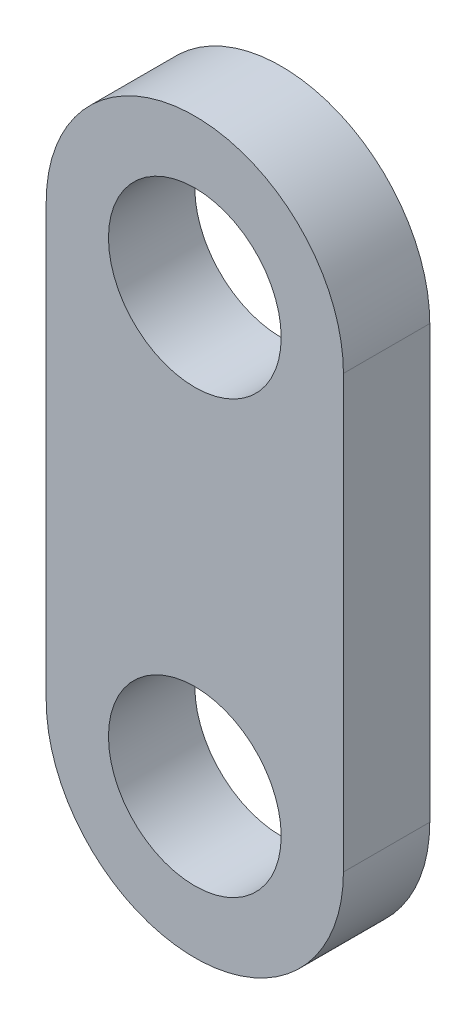
ISO-10303-21;
HEADER;
FILE_DESCRIPTION(('STEP AP214'),'2;1');
FILE_NAME('part.step','',(''),(''),'','','');
FILE_SCHEMA(('AUTOMOTIVE_DESIGN { 1 0 10303 214 1 1 1 1 }'));
ENDSEC;
DATA;
#1=APPLICATION_CONTEXT('core data for automotive mechanical design processes');
#2=APPLICATION_PROTOCOL_DEFINITION('international standard','automotive_design',2000,#1);
#3=PRODUCT_CONTEXT('',#1,'mechanical');
#4=PRODUCT('Part','Part','',(#3));
#5=PRODUCT_RELATED_PRODUCT_CATEGORY('part','',(#4));
#6=PRODUCT_DEFINITION_FORMATION('','',#4);
#7=PRODUCT_DEFINITION_CONTEXT('part definition',#1,'design');
#8=PRODUCT_DEFINITION('design','',#6,#7);
#9=PRODUCT_DEFINITION_SHAPE('','',#8);
#10=(LENGTH_UNIT() NAMED_UNIT(*) SI_UNIT(.MILLI.,.METRE.));
#11=(NAMED_UNIT(*) PLANE_ANGLE_UNIT() SI_UNIT($,.RADIAN.));
#12=(NAMED_UNIT(*) SI_UNIT($,.STERADIAN.) SOLID_ANGLE_UNIT());
#13=UNCERTAINTY_MEASURE_WITH_UNIT(LENGTH_MEASURE(1.E-05),#10,'distance_accuracy_value','');
#14=(GEOMETRIC_REPRESENTATION_CONTEXT(3) GLOBAL_UNCERTAINTY_ASSIGNED_CONTEXT((#13)) GLOBAL_UNIT_ASSIGNED_CONTEXT((#10,
#11,#12)) REPRESENTATION_CONTEXT('',''));
#15=CARTESIAN_POINT('',(0.,0.,0.));
#16=DIRECTION('',(0.,0.,1.));
#17=DIRECTION('',(1.,0.,0.));
#18=AXIS2_PLACEMENT_3D('',#15,#16,#17);
#19=CARTESIAN_POINT('',(-0.454545454545453,6.26623376623377,4.));
#20=DIRECTION('',(0.,0.,1.));
#21=DIRECTION('',(1.,0.,0.));
#22=AXIS2_PLACEMENT_3D('',#19,#20,#21);
#23=PLANE('',#22);
#24=CARTESIAN_POINT('',(-0.454545454545453,6.26623376623377,4.));
#25=DIRECTION('',(0.,0.,1.));
#26=DIRECTION('',(1.,0.,0.));
#27=AXIS2_PLACEMENT_3D('',#24,#25,#26);
#28=CIRCLE('',#27,4.);
#29=CARTESIAN_POINT('',(3.54545454545455,6.26623376623377,4.));
#30=VERTEX_POINT('',#29);
#31=EDGE_CURVE('E100',#30,#30,#28,.T.);
#32=ORIENTED_EDGE('',*,*,#31,.F.);
#33=EDGE_LOOP('',(#32));
#34=FACE_BOUND('',#33,.T.);
#35=CARTESIAN_POINT('',(-0.454545454545453,6.26623376623377,4.));
#36=DIRECTION('',(0.,0.,1.));
#37=DIRECTION('',(1.,0.,0.));
#38=AXIS2_PLACEMENT_3D('',#35,#36,#37);
#39=CIRCLE('',#38,6.88311688311688);
#40=CARTESIAN_POINT('',(6.42857142857143,6.26623376623377,4.));
#41=VERTEX_POINT('',#40);
#42=CARTESIAN_POINT('',(-7.33766233766233,6.26623376623377,4.));
#43=VERTEX_POINT('',#42);
#44=EDGE_CURVE('E85',#41,#43,#39,.T.);
#45=ORIENTED_EDGE('',*,*,#44,.T.);
#46=DIRECTION('',(0.,-1.,0.));
#47=VECTOR('',#46,1.);
#48=CARTESIAN_POINT('',(-7.33766233766233,6.26623376623377,4.));
#49=LINE('',#48,#47);
#50=CARTESIAN_POINT('',(-7.33766233766233,-13.7337662337662,4.));
#51=VERTEX_POINT('',#50);
#52=EDGE_CURVE('E80',#43,#51,#49,.T.);
#53=ORIENTED_EDGE('',*,*,#52,.T.);
#54=CARTESIAN_POINT('',(-0.454545454545453,-13.7337662337662,4.));
#55=DIRECTION('',(0.,0.,1.));
#56=DIRECTION('',(1.,0.,0.));
#57=AXIS2_PLACEMENT_3D('',#54,#55,#56);
#58=CIRCLE('',#57,6.88311688311688);
#59=CARTESIAN_POINT('',(6.42857142857143,-13.7337662337662,4.));
#60=VERTEX_POINT('',#59);
#61=EDGE_CURVE('E83',#51,#60,#58,.T.);
#62=ORIENTED_EDGE('',*,*,#61,.T.);
#63=DIRECTION('',(0.,1.,0.));
#64=VECTOR('',#63,1.);
#65=CARTESIAN_POINT('',(6.42857142857143,6.26623376623377,4.));
#66=LINE('',#65,#64);
#67=EDGE_CURVE('E50',#60,#41,#66,.T.);
#68=ORIENTED_EDGE('',*,*,#67,.T.);
#69=EDGE_LOOP('',(#45,#53,#62,#68));
#70=FACE_BOUND('',#69,.T.);
#71=CARTESIAN_POINT('',(-0.454545454545453,-13.7337662337662,4.));
#72=DIRECTION('',(0.,0.,1.));
#73=DIRECTION('',(1.,0.,0.));
#74=AXIS2_PLACEMENT_3D('',#71,#72,#73);
#75=CIRCLE('',#74,4.);
#76=CARTESIAN_POINT('',(3.54545454545455,-13.7337662337662,4.));
#77=VERTEX_POINT('',#76);
#78=EDGE_CURVE('E115',#77,#77,#75,.T.);
#79=ORIENTED_EDGE('',*,*,#78,.F.);
#80=EDGE_LOOP('',(#79));
#81=FACE_BOUND('',#80,.T.);
#82=ADVANCED_FACE('F33',(#34,#70,#81),#23,.T.);
#83=CARTESIAN_POINT('',(-0.454545454545453,6.26623376623377,0.));
#84=DIRECTION('',(0.,0.,1.));
#85=DIRECTION('',(1.,0.,0.));
#86=AXIS2_PLACEMENT_3D('',#83,#84,#85);
#87=PLANE('',#86);
#88=CARTESIAN_POINT('',(-0.454545454545453,6.26623376623377,0.));
#89=DIRECTION('',(0.,0.,1.));
#90=DIRECTION('',(1.,0.,0.));
#91=AXIS2_PLACEMENT_3D('',#88,#89,#90);
#92=CIRCLE('',#91,6.88311688311688);
#93=CARTESIAN_POINT('',(6.42857142857143,6.26623376623377,0.));
#94=VERTEX_POINT('',#93);
#95=CARTESIAN_POINT('',(-7.33766233766233,6.26623376623377,0.));
#96=VERTEX_POINT('',#95);
#97=EDGE_CURVE('E97',#94,#96,#92,.T.);
#98=ORIENTED_EDGE('',*,*,#97,.F.);
#99=DIRECTION('',(0.,1.,0.));
#100=VECTOR('',#99,1.);
#101=CARTESIAN_POINT('',(6.42857142857143,6.26623376623377,0.));
#102=LINE('',#101,#100);
#103=CARTESIAN_POINT('',(6.42857142857143,-13.7337662337662,0.));
#104=VERTEX_POINT('',#103);
#105=EDGE_CURVE('E73',#104,#94,#102,.T.);
#106=ORIENTED_EDGE('',*,*,#105,.F.);
#107=CARTESIAN_POINT('',(-0.454545454545453,-13.7337662337662,0.));
#108=DIRECTION('',(0.,0.,1.));
#109=DIRECTION('',(1.,0.,0.));
#110=AXIS2_PLACEMENT_3D('',#107,#108,#109);
#111=CIRCLE('',#110,6.88311688311688);
#112=CARTESIAN_POINT('',(-7.33766233766233,-13.7337662337662,0.));
#113=VERTEX_POINT('',#112);
#114=EDGE_CURVE('E67',#113,#104,#111,.T.);
#115=ORIENTED_EDGE('',*,*,#114,.F.);
#116=DIRECTION('',(0.,-1.,0.));
#117=VECTOR('',#116,1.);
#118=CARTESIAN_POINT('',(-7.33766233766233,6.26623376623377,0.));
#119=LINE('',#118,#117);
#120=EDGE_CURVE('E89',#96,#113,#119,.T.);
#121=ORIENTED_EDGE('',*,*,#120,.F.);
#122=EDGE_LOOP('',(#98,#106,#115,#121));
#123=FACE_BOUND('',#122,.T.);
#124=CARTESIAN_POINT('',(-0.454545454545453,6.26623376623377,0.));
#125=DIRECTION('',(0.,0.,1.));
#126=DIRECTION('',(1.,0.,0.));
#127=AXIS2_PLACEMENT_3D('',#124,#125,#126);
#128=CIRCLE('',#127,4.);
#129=CARTESIAN_POINT('',(3.54545454545455,6.26623376623377,0.));
#130=VERTEX_POINT('',#129);
#131=EDGE_CURVE('E112',#130,#130,#128,.T.);
#132=ORIENTED_EDGE('',*,*,#131,.T.);
#133=EDGE_LOOP('',(#132));
#134=FACE_BOUND('',#133,.T.);
#135=CARTESIAN_POINT('',(-0.454545454545453,-13.7337662337662,0.));
#136=DIRECTION('',(0.,0.,1.));
#137=DIRECTION('',(1.,0.,0.));
#138=AXIS2_PLACEMENT_3D('',#135,#136,#137);
#139=CIRCLE('',#138,4.);
#140=CARTESIAN_POINT('',(3.54545454545455,-13.7337662337662,0.));
#141=VERTEX_POINT('',#140);
#142=EDGE_CURVE('E118',#141,#141,#139,.T.);
#143=ORIENTED_EDGE('',*,*,#142,.T.);
#144=EDGE_LOOP('',(#143));
#145=FACE_BOUND('',#144,.T.);
#146=ADVANCED_FACE('F108',(#123,#134,#145),#87,.F.);
#147=CARTESIAN_POINT('',(-0.454545454545453,6.26623376623377,4.));
#148=DIRECTION('',(0.,0.,-1.));
#149=DIRECTION('',(-1.,0.,0.));
#150=AXIS2_PLACEMENT_3D('',#147,#148,#149);
#151=CYLINDRICAL_SURFACE('',#150,6.88311688311688);
#152=ORIENTED_EDGE('',*,*,#97,.T.);
#153=DIRECTION('',(0.,0.,-1.));
#154=VECTOR('',#153,1.);
#155=CARTESIAN_POINT('',(-7.33766233766233,6.26623376623377,4.));
#156=LINE('',#155,#154);
#157=EDGE_CURVE('E11',#43,#96,#156,.T.);
#158=ORIENTED_EDGE('',*,*,#157,.F.);
#159=ORIENTED_EDGE('',*,*,#44,.F.);
#160=DIRECTION('',(0.,0.,-1.));
#161=VECTOR('',#160,1.);
#162=CARTESIAN_POINT('',(6.42857142857143,6.26623376623377,4.));
#163=LINE('',#162,#161);
#164=EDGE_CURVE('E93',#41,#94,#163,.T.);
#165=ORIENTED_EDGE('',*,*,#164,.T.);
#166=EDGE_LOOP('',(#152,#158,#159,#165));
#167=FACE_BOUND('',#166,.T.);
#168=ADVANCED_FACE('F35',(#167),#151,.T.);
#169=CARTESIAN_POINT('',(-7.33766233766233,6.26623376623377,4.));
#170=DIRECTION('',(1.,0.,0.));
#171=DIRECTION('',(0.,0.,-1.));
#172=AXIS2_PLACEMENT_3D('',#169,#170,#171);
#173=PLANE('',#172);
#174=ORIENTED_EDGE('',*,*,#120,.T.);
#175=DIRECTION('',(0.,0.,-1.));
#176=VECTOR('',#175,1.);
#177=CARTESIAN_POINT('',(-7.33766233766233,-13.7337662337662,4.));
#178=LINE('',#177,#176);
#179=EDGE_CURVE('E42',#51,#113,#178,.T.);
#180=ORIENTED_EDGE('',*,*,#179,.F.);
#181=ORIENTED_EDGE('',*,*,#52,.F.);
#182=ORIENTED_EDGE('',*,*,#157,.T.);
#183=EDGE_LOOP('',(#174,#180,#181,#182));
#184=FACE_BOUND('',#183,.T.);
#185=ADVANCED_FACE('F88',(#184),#173,.F.);
#186=CARTESIAN_POINT('',(-0.454545454545453,-13.7337662337662,4.));
#187=DIRECTION('',(0.,0.,-1.));
#188=DIRECTION('',(-1.,0.,0.));
#189=AXIS2_PLACEMENT_3D('',#186,#187,#188);
#190=CYLINDRICAL_SURFACE('',#189,6.88311688311688);
#191=ORIENTED_EDGE('',*,*,#114,.T.);
#192=DIRECTION('',(0.,0.,-1.));
#193=VECTOR('',#192,1.);
#194=CARTESIAN_POINT('',(6.42857142857143,-13.7337662337662,4.));
#195=LINE('',#194,#193);
#196=EDGE_CURVE('E90',#60,#104,#195,.T.);
#197=ORIENTED_EDGE('',*,*,#196,.F.);
#198=ORIENTED_EDGE('',*,*,#61,.F.);
#199=ORIENTED_EDGE('',*,*,#179,.T.);
#200=EDGE_LOOP('',(#191,#197,#198,#199));
#201=FACE_BOUND('',#200,.T.);
#202=ADVANCED_FACE('F91',(#201),#190,.T.);
#203=CARTESIAN_POINT('',(6.42857142857143,6.26623376623377,4.));
#204=DIRECTION('',(-1.,0.,0.));
#205=DIRECTION('',(0.,0.,1.));
#206=AXIS2_PLACEMENT_3D('',#203,#204,#205);
#207=PLANE('',#206);
#208=ORIENTED_EDGE('',*,*,#105,.T.);
#209=ORIENTED_EDGE('',*,*,#164,.F.);
#210=ORIENTED_EDGE('',*,*,#67,.F.);
#211=ORIENTED_EDGE('',*,*,#196,.T.);
#212=EDGE_LOOP('',(#208,#209,#210,#211));
#213=FACE_BOUND('',#212,.T.);
#214=ADVANCED_FACE('F105',(#213),#207,.F.);
#215=CARTESIAN_POINT('',(-0.454545454545453,6.26623376623377,4.));
#216=DIRECTION('',(0.,0.,-1.));
#217=DIRECTION('',(-1.,0.,0.));
#218=AXIS2_PLACEMENT_3D('',#215,#216,#217);
#219=CYLINDRICAL_SURFACE('',#218,4.);
#220=ORIENTED_EDGE('',*,*,#31,.T.);
#221=EDGE_LOOP('',(#220));
#222=FACE_BOUND('',#221,.T.);
#223=ORIENTED_EDGE('',*,*,#131,.F.);
#224=EDGE_LOOP('',(#223));
#225=FACE_BOUND('',#224,.T.);
#226=ADVANCED_FACE('F135',(#222,#225),#219,.F.);
#227=CARTESIAN_POINT('',(-0.454545454545453,-13.7337662337662,4.));
#228=DIRECTION('',(0.,0.,-1.));
#229=DIRECTION('',(-1.,0.,0.));
#230=AXIS2_PLACEMENT_3D('',#227,#228,#229);
#231=CYLINDRICAL_SURFACE('',#230,4.);
#232=ORIENTED_EDGE('',*,*,#78,.T.);
#233=EDGE_LOOP('',(#232));
#234=FACE_BOUND('',#233,.T.);
#235=ORIENTED_EDGE('',*,*,#142,.F.);
#236=EDGE_LOOP('',(#235));
#237=FACE_BOUND('',#236,.T.);
#238=ADVANCED_FACE('F124',(#234,#237),#231,.F.);
#239=CLOSED_SHELL('',(#82,#146,#168,#185,#202,#214,#226,#238));
#240=MANIFOLD_SOLID_BREP('B2',#239);
#241=ADVANCED_BREP_SHAPE_REPRESENTATION('',(#18,#240),#14);
#242=SHAPE_DEFINITION_REPRESENTATION(#9,#241);
ENDSEC;
END-ISO-10303-21;
